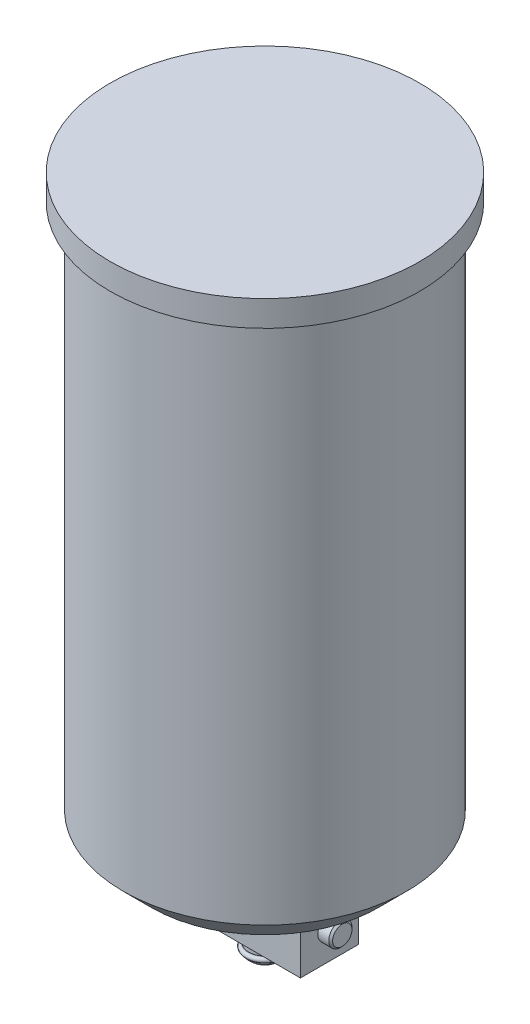
ISO-10303-21;
HEADER;
FILE_DESCRIPTION(('STEP AP214'),'2;1');
FILE_NAME('part.step','',(''),(''),'','','');
FILE_SCHEMA(('AUTOMOTIVE_DESIGN { 1 0 10303 214 1 1 1 1 }'));
ENDSEC;
DATA;
#1=APPLICATION_CONTEXT('core data for automotive mechanical design processes');
#2=APPLICATION_PROTOCOL_DEFINITION('international standard','automotive_design',2000,#1);
#3=PRODUCT_CONTEXT('',#1,'mechanical');
#4=PRODUCT('Part','Part','',(#3));
#5=PRODUCT_RELATED_PRODUCT_CATEGORY('part','',(#4));
#6=PRODUCT_DEFINITION_FORMATION('','',#4);
#7=PRODUCT_DEFINITION_CONTEXT('part definition',#1,'design');
#8=PRODUCT_DEFINITION('design','',#6,#7);
#9=PRODUCT_DEFINITION_SHAPE('','',#8);
#10=(LENGTH_UNIT() NAMED_UNIT(*) SI_UNIT(.MILLI.,.METRE.));
#11=(NAMED_UNIT(*) PLANE_ANGLE_UNIT() SI_UNIT($,.RADIAN.));
#12=(NAMED_UNIT(*) SI_UNIT($,.STERADIAN.) SOLID_ANGLE_UNIT());
#13=UNCERTAINTY_MEASURE_WITH_UNIT(LENGTH_MEASURE(1.E-05),#10,'distance_accuracy_value','');
#14=(GEOMETRIC_REPRESENTATION_CONTEXT(3) GLOBAL_UNCERTAINTY_ASSIGNED_CONTEXT((#13)) GLOBAL_UNIT_ASSIGNED_CONTEXT((#10,
#11,#12)) REPRESENTATION_CONTEXT('',''));
#15=CARTESIAN_POINT('',(0.,0.,0.));
#16=DIRECTION('',(0.,0.,1.));
#17=DIRECTION('',(1.,0.,0.));
#18=AXIS2_PLACEMENT_3D('',#15,#16,#17);
#19=CARTESIAN_POINT('',(-10.,-11.,-4.5));
#20=DIRECTION('',(-1.,0.,0.));
#21=DIRECTION('',(0.,0.,1.));
#22=AXIS2_PLACEMENT_3D('',#19,#20,#21);
#23=PLANE('',#22);
#24=DIRECTION('',(0.,0.,1.));
#25=VECTOR('',#24,1.);
#26=CARTESIAN_POINT('',(-10.,-2.,-5.5));
#27=LINE('',#26,#25);
#28=CARTESIAN_POINT('',(-10.,-2.,-5.5));
#29=VERTEX_POINT('',#28);
#30=CARTESIAN_POINT('',(-10.,-2.,-4.5));
#31=VERTEX_POINT('',#30);
#32=EDGE_CURVE('E108',#29,#31,#27,.T.);
#33=ORIENTED_EDGE('',*,*,#32,.T.);
#34=DIRECTION('',(0.,1.,0.));
#35=VECTOR('',#34,1.);
#36=CARTESIAN_POINT('',(-10.,-11.,-4.5));
#37=LINE('',#36,#35);
#38=CARTESIAN_POINT('',(-10.,-11.,-4.5));
#39=VERTEX_POINT('',#38);
#40=EDGE_CURVE('E159',#39,#31,#37,.T.);
#41=ORIENTED_EDGE('',*,*,#40,.F.);
#42=DIRECTION('',(0.,0.,1.));
#43=VECTOR('',#42,1.);
#44=CARTESIAN_POINT('',(-10.,-11.,-4.5));
#45=LINE('',#44,#43);
#46=CARTESIAN_POINT('',(-10.,-11.,4.5));
#47=VERTEX_POINT('',#46);
#48=EDGE_CURVE('E145',#39,#47,#45,.T.);
#49=ORIENTED_EDGE('',*,*,#48,.T.);
#50=DIRECTION('',(0.,1.,0.));
#51=VECTOR('',#50,1.);
#52=CARTESIAN_POINT('',(-10.,-11.,4.5));
#53=LINE('',#52,#51);
#54=CARTESIAN_POINT('',(-10.,-2.,4.5));
#55=VERTEX_POINT('',#54);
#56=EDGE_CURVE('E107',#47,#55,#53,.T.);
#57=ORIENTED_EDGE('',*,*,#56,.T.);
#58=CARTESIAN_POINT('',(-10.,-2.,5.5));
#59=VERTEX_POINT('',#58);
#60=EDGE_CURVE('E59',#55,#59,#27,.T.);
#61=ORIENTED_EDGE('',*,*,#60,.T.);
#62=DIRECTION('',(0.,1.,0.));
#63=VECTOR('',#62,1.);
#64=CARTESIAN_POINT('',(-10.,-2.,5.5));
#65=LINE('',#64,#63);
#66=CARTESIAN_POINT('',(-10.,0.,5.5));
#67=VERTEX_POINT('',#66);
#68=EDGE_CURVE('E104',#59,#67,#65,.T.);
#69=ORIENTED_EDGE('',*,*,#68,.T.);
#70=DIRECTION('',(0.,0.,1.));
#71=VECTOR('',#70,1.);
#72=CARTESIAN_POINT('',(-10.,0.,-4.5));
#73=LINE('',#72,#71);
#74=CARTESIAN_POINT('',(-10.,0.,-5.5));
#75=VERTEX_POINT('',#74);
#76=EDGE_CURVE('E144',#75,#67,#73,.T.);
#77=ORIENTED_EDGE('',*,*,#76,.F.);
#78=DIRECTION('',(0.,1.,0.));
#79=VECTOR('',#78,1.);
#80=CARTESIAN_POINT('',(-10.,-2.,-5.5));
#81=LINE('',#80,#79);
#82=EDGE_CURVE('E135',#29,#75,#81,.T.);
#83=ORIENTED_EDGE('',*,*,#82,.F.);
#84=EDGE_LOOP('',(#33,#41,#49,#57,#61,#69,#77,#83));
#85=FACE_BOUND('',#84,.T.);
#86=CARTESIAN_POINT('',(-10.,-6.5,0.));
#87=DIRECTION('',(-1.,0.,0.));
#88=DIRECTION('',(0.,0.,1.));
#89=AXIS2_PLACEMENT_3D('',#86,#87,#88);
#90=CIRCLE('',#89,0.900000000000001);
#91=CARTESIAN_POINT('',(-10.,-6.5,0.900000000000001));
#92=VERTEX_POINT('',#91);
#93=EDGE_CURVE('E38',#92,#92,#90,.F.);
#94=ORIENTED_EDGE('',*,*,#93,.T.);
#95=EDGE_LOOP('',(#94));
#96=FACE_BOUND('',#95,.T.);
#97=ADVANCED_FACE('F34',(#85,#96),#23,.T.);
#98=CARTESIAN_POINT('',(10.,-11.,4.5));
#99=DIRECTION('',(1.,0.,0.));
#100=DIRECTION('',(0.,0.,-1.));
#101=AXIS2_PLACEMENT_3D('',#98,#99,#100);
#102=PLANE('',#101);
#103=DIRECTION('',(0.,0.,-1.));
#104=VECTOR('',#103,1.);
#105=CARTESIAN_POINT('',(10.,-2.,5.5));
#106=LINE('',#105,#104);
#107=CARTESIAN_POINT('',(10.,-2.,5.5));
#108=VERTEX_POINT('',#107);
#109=CARTESIAN_POINT('',(10.,-2.,4.5));
#110=VERTEX_POINT('',#109);
#111=EDGE_CURVE('E124',#108,#110,#106,.T.);
#112=ORIENTED_EDGE('',*,*,#111,.T.);
#113=DIRECTION('',(0.,1.,0.));
#114=VECTOR('',#113,1.);
#115=CARTESIAN_POINT('',(10.,-11.,4.5));
#116=LINE('',#115,#114);
#117=CARTESIAN_POINT('',(10.,-11.,4.5));
#118=VERTEX_POINT('',#117);
#119=EDGE_CURVE('E166',#118,#110,#116,.T.);
#120=ORIENTED_EDGE('',*,*,#119,.F.);
#121=DIRECTION('',(0.,0.,-1.));
#122=VECTOR('',#121,1.);
#123=CARTESIAN_POINT('',(10.,-11.,4.5));
#124=LINE('',#123,#122);
#125=CARTESIAN_POINT('',(10.,-11.,-4.5));
#126=VERTEX_POINT('',#125);
#127=EDGE_CURVE('E151',#118,#126,#124,.T.);
#128=ORIENTED_EDGE('',*,*,#127,.T.);
#129=DIRECTION('',(0.,1.,0.));
#130=VECTOR('',#129,1.);
#131=CARTESIAN_POINT('',(10.,-11.,-4.5));
#132=LINE('',#131,#130);
#133=CARTESIAN_POINT('',(10.,-2.,-4.5));
#134=VERTEX_POINT('',#133);
#135=EDGE_CURVE('E163',#126,#134,#132,.T.);
#136=ORIENTED_EDGE('',*,*,#135,.T.);
#137=CARTESIAN_POINT('',(10.,-2.,-5.5));
#138=VERTEX_POINT('',#137);
#139=EDGE_CURVE('E51',#134,#138,#106,.T.);
#140=ORIENTED_EDGE('',*,*,#139,.T.);
#141=DIRECTION('',(0.,1.,0.));
#142=VECTOR('',#141,1.);
#143=CARTESIAN_POINT('',(10.,-2.,-5.5));
#144=LINE('',#143,#142);
#145=CARTESIAN_POINT('',(10.,0.,-5.5));
#146=VERTEX_POINT('',#145);
#147=EDGE_CURVE('E139',#138,#146,#144,.T.);
#148=ORIENTED_EDGE('',*,*,#147,.T.);
#149=DIRECTION('',(0.,0.,-1.));
#150=VECTOR('',#149,1.);
#151=CARTESIAN_POINT('',(10.,0.,4.5));
#152=LINE('',#151,#150);
#153=CARTESIAN_POINT('',(10.,0.,5.5));
#154=VERTEX_POINT('',#153);
#155=EDGE_CURVE('E148',#154,#146,#152,.T.);
#156=ORIENTED_EDGE('',*,*,#155,.F.);
#157=DIRECTION('',(0.,1.,0.));
#158=VECTOR('',#157,1.);
#159=CARTESIAN_POINT('',(10.,-2.,5.5));
#160=LINE('',#159,#158);
#161=EDGE_CURVE('E118',#108,#154,#160,.T.);
#162=ORIENTED_EDGE('',*,*,#161,.F.);
#163=EDGE_LOOP('',(#112,#120,#128,#136,#140,#148,#156,#162));
#164=FACE_BOUND('',#163,.T.);
#165=CARTESIAN_POINT('',(10.,-6.5,0.));
#166=DIRECTION('',(1.,0.,0.));
#167=DIRECTION('',(0.,0.,-1.));
#168=AXIS2_PLACEMENT_3D('',#165,#166,#167);
#169=CIRCLE('',#168,1.8);
#170=CARTESIAN_POINT('',(10.,-6.5,-1.8));
#171=VERTEX_POINT('',#170);
#172=EDGE_CURVE('E184',#171,#171,#169,.F.);
#173=ORIENTED_EDGE('',*,*,#172,.T.);
#174=EDGE_LOOP('',(#173));
#175=FACE_BOUND('',#174,.T.);
#176=ADVANCED_FACE('F270',(#164,#175),#102,.T.);
#177=CARTESIAN_POINT('',(0.,-11.,0.));
#178=DIRECTION('',(0.,1.,0.));
#179=DIRECTION('',(0.,0.,1.));
#180=AXIS2_PLACEMENT_3D('',#177,#178,#179);
#181=PLANE('',#180);
#182=ORIENTED_EDGE('',*,*,#48,.F.);
#183=DIRECTION('',(-1.,0.,0.));
#184=VECTOR('',#183,1.);
#185=CARTESIAN_POINT('',(10.,-11.,-4.5));
#186=LINE('',#185,#184);
#187=EDGE_CURVE('E154',#126,#39,#186,.T.);
#188=ORIENTED_EDGE('',*,*,#187,.F.);
#189=ORIENTED_EDGE('',*,*,#127,.F.);
#190=DIRECTION('',(1.,0.,0.));
#191=VECTOR('',#190,1.);
#192=CARTESIAN_POINT('',(-10.,-11.,4.5));
#193=LINE('',#192,#191);
#194=EDGE_CURVE('E147',#47,#118,#193,.T.);
#195=ORIENTED_EDGE('',*,*,#194,.F.);
#196=EDGE_LOOP('',(#182,#188,#189,#195));
#197=FACE_BOUND('',#196,.T.);
#198=CARTESIAN_POINT('',(0.,-11.,0.));
#199=DIRECTION('',(0.,1.,0.));
#200=DIRECTION('',(0.,0.,1.));
#201=AXIS2_PLACEMENT_3D('',#198,#199,#200);
#202=CIRCLE('',#201,2.5);
#203=CARTESIAN_POINT('',(0.,-11.,2.5));
#204=VERTEX_POINT('',#203);
#205=EDGE_CURVE('E11',#204,#204,#202,.F.);
#206=ORIENTED_EDGE('',*,*,#205,.F.);
#207=EDGE_LOOP('',(#206));
#208=FACE_BOUND('',#207,.T.);
#209=ADVANCED_FACE('F275',(#197,#208),#181,.F.);
#210=CARTESIAN_POINT('',(10.,-11.,-4.5));
#211=DIRECTION('',(0.,0.,-1.));
#212=DIRECTION('',(-1.,0.,0.));
#213=AXIS2_PLACEMENT_3D('',#210,#211,#212);
#214=PLANE('',#213);
#215=ORIENTED_EDGE('',*,*,#40,.T.);
#216=DIRECTION('',(1.,0.,0.));
#217=VECTOR('',#216,1.);
#218=CARTESIAN_POINT('',(10.,-2.,-4.5));
#219=LINE('',#218,#217);
#220=EDGE_CURVE('E138',#31,#134,#219,.T.);
#221=ORIENTED_EDGE('',*,*,#220,.T.);
#222=ORIENTED_EDGE('',*,*,#135,.F.);
#223=ORIENTED_EDGE('',*,*,#187,.T.);
#224=EDGE_LOOP('',(#215,#221,#222,#223));
#225=FACE_BOUND('',#224,.T.);
#226=ADVANCED_FACE('F316',(#225),#214,.T.);
#227=CARTESIAN_POINT('',(-10.,-11.,4.5));
#228=DIRECTION('',(0.,0.,1.));
#229=DIRECTION('',(1.,0.,0.));
#230=AXIS2_PLACEMENT_3D('',#227,#228,#229);
#231=PLANE('',#230);
#232=ORIENTED_EDGE('',*,*,#119,.T.);
#233=DIRECTION('',(-1.,0.,0.));
#234=VECTOR('',#233,1.);
#235=CARTESIAN_POINT('',(-10.,-2.,4.5));
#236=LINE('',#235,#234);
#237=EDGE_CURVE('E43',#110,#55,#236,.T.);
#238=ORIENTED_EDGE('',*,*,#237,.T.);
#239=ORIENTED_EDGE('',*,*,#56,.F.);
#240=ORIENTED_EDGE('',*,*,#194,.T.);
#241=EDGE_LOOP('',(#232,#238,#239,#240));
#242=FACE_BOUND('',#241,.T.);
#243=ADVANCED_FACE('F280',(#242),#231,.T.);
#244=CARTESIAN_POINT('',(0.,90.,0.));
#245=DIRECTION('',(0.,-1.,0.));
#246=DIRECTION('',(0.,0.,-1.));
#247=AXIS2_PLACEMENT_3D('',#244,#245,#246);
#248=PLANE('',#247);
#249=CARTESIAN_POINT('',(0.,90.,0.));
#250=DIRECTION('',(0.,1.,0.));
#251=DIRECTION('',(0.,0.,1.));
#252=AXIS2_PLACEMENT_3D('',#249,#250,#251);
#253=CIRCLE('',#252,24.);
#254=CARTESIAN_POINT('',(0.,90.,24.));
#255=VERTEX_POINT('',#254);
#256=EDGE_CURVE('E181',#255,#255,#253,.T.);
#257=ORIENTED_EDGE('',*,*,#256,.T.);
#258=EDGE_LOOP('',(#257));
#259=FACE_BOUND('',#258,.T.);
#260=ADVANCED_FACE('F36',(#259),#248,.F.);
#261=CARTESIAN_POINT('',(0.,0.,0.));
#262=DIRECTION('',(0.,1.,0.));
#263=DIRECTION('',(0.,0.,1.));
#264=AXIS2_PLACEMENT_3D('',#261,#262,#263);
#265=CYLINDRICAL_SURFACE('',#264,24.);
#266=ORIENTED_EDGE('',*,*,#256,.F.);
#267=EDGE_LOOP('',(#266));
#268=FACE_BOUND('',#267,.T.);
#269=CARTESIAN_POINT('',(0.,86.,0.));
#270=DIRECTION('',(0.,1.,0.));
#271=DIRECTION('',(0.,0.,1.));
#272=AXIS2_PLACEMENT_3D('',#269,#270,#271);
#273=CIRCLE('',#272,24.);
#274=CARTESIAN_POINT('',(0.,86.,24.));
#275=VERTEX_POINT('',#274);
#276=EDGE_CURVE('E178',#275,#275,#273,.T.);
#277=ORIENTED_EDGE('',*,*,#276,.T.);
#278=EDGE_LOOP('',(#277));
#279=FACE_BOUND('',#278,.T.);
#280=ADVANCED_FACE('F295',(#268,#279),#265,.T.);
#281=CARTESIAN_POINT('',(24.,86.,0.));
#282=DIRECTION('',(0.,1.,0.));
#283=DIRECTION('',(0.,0.,1.));
#284=AXIS2_PLACEMENT_3D('',#281,#282,#283);
#285=PLANE('',#284);
#286=ORIENTED_EDGE('',*,*,#276,.F.);
#287=EDGE_LOOP('',(#286));
#288=FACE_BOUND('',#287,.T.);
#289=CARTESIAN_POINT('',(0.,86.,0.));
#290=DIRECTION('',(0.,1.,0.));
#291=DIRECTION('',(0.,0.,1.));
#292=AXIS2_PLACEMENT_3D('',#289,#290,#291);
#293=CIRCLE('',#292,22.);
#294=CARTESIAN_POINT('',(0.,86.,22.));
#295=VERTEX_POINT('',#294);
#296=EDGE_CURVE('E175',#295,#295,#293,.T.);
#297=ORIENTED_EDGE('',*,*,#296,.T.);
#298=EDGE_LOOP('',(#297));
#299=FACE_BOUND('',#298,.T.);
#300=ADVANCED_FACE('F292',(#288,#299),#285,.F.);
#301=CARTESIAN_POINT('',(0.,0.,0.));
#302=DIRECTION('',(0.,1.,0.));
#303=DIRECTION('',(0.,0.,1.));
#304=AXIS2_PLACEMENT_3D('',#301,#302,#303);
#305=CYLINDRICAL_SURFACE('',#304,22.);
#306=ORIENTED_EDGE('',*,*,#296,.F.);
#307=EDGE_LOOP('',(#306));
#308=FACE_BOUND('',#307,.T.);
#309=CARTESIAN_POINT('',(0.,4.40000000000001,0.));
#310=DIRECTION('',(0.,1.,0.));
#311=DIRECTION('',(0.,0.,1.));
#312=AXIS2_PLACEMENT_3D('',#309,#310,#311);
#313=CIRCLE('',#312,22.);
#314=CARTESIAN_POINT('',(0.,4.40000000000001,22.));
#315=VERTEX_POINT('',#314);
#316=EDGE_CURVE('E172',#315,#315,#313,.T.);
#317=ORIENTED_EDGE('',*,*,#316,.T.);
#318=EDGE_LOOP('',(#317));
#319=FACE_BOUND('',#318,.T.);
#320=ADVANCED_FACE('F288',(#308,#319),#305,.T.);
#321=CARTESIAN_POINT('',(0.,0.,0.));
#322=DIRECTION('',(0.,1.,0.));
#323=DIRECTION('',(0.,0.,1.));
#324=AXIS2_PLACEMENT_3D('',#321,#322,#323);
#325=CONICAL_SURFACE('',#324,17.6,0.785398163397447);
#326=ORIENTED_EDGE('',*,*,#316,.F.);
#327=EDGE_LOOP('',(#326));
#328=FACE_BOUND('',#327,.T.);
#329=CARTESIAN_POINT('',(0.,0.,0.));
#330=DIRECTION('',(0.,1.,0.));
#331=DIRECTION('',(0.,0.,1.));
#332=AXIS2_PLACEMENT_3D('',#329,#330,#331);
#333=CIRCLE('',#332,17.6);
#334=CARTESIAN_POINT('',(0.,0.,17.6));
#335=VERTEX_POINT('',#334);
#336=EDGE_CURVE('E162',#335,#335,#333,.T.);
#337=ORIENTED_EDGE('',*,*,#336,.T.);
#338=EDGE_LOOP('',(#337));
#339=FACE_BOUND('',#338,.T.);
#340=ADVANCED_FACE('F284',(#328,#339),#325,.T.);
#341=CARTESIAN_POINT('',(17.6,0.,0.));
#342=DIRECTION('',(0.,1.,0.));
#343=DIRECTION('',(0.,0.,1.));
#344=AXIS2_PLACEMENT_3D('',#341,#342,#343);
#345=PLANE('',#344);
#346=DIRECTION('',(-1.,0.,0.));
#347=VECTOR('',#346,1.);
#348=CARTESIAN_POINT('',(10.,0.,-5.5));
#349=LINE('',#348,#347);
#350=EDGE_CURVE('E109',#146,#75,#349,.T.);
#351=ORIENTED_EDGE('',*,*,#350,.T.);
#352=ORIENTED_EDGE('',*,*,#76,.T.);
#353=DIRECTION('',(1.,0.,0.));
#354=VECTOR('',#353,1.);
#355=CARTESIAN_POINT('',(-10.,0.,5.5));
#356=LINE('',#355,#354);
#357=EDGE_CURVE('E117',#67,#154,#356,.T.);
#358=ORIENTED_EDGE('',*,*,#357,.T.);
#359=ORIENTED_EDGE('',*,*,#155,.T.);
#360=EDGE_LOOP('',(#351,#352,#358,#359));
#361=FACE_BOUND('',#360,.T.);
#362=ORIENTED_EDGE('',*,*,#336,.F.);
#363=EDGE_LOOP('',(#362));
#364=FACE_BOUND('',#363,.T.);
#365=ADVANCED_FACE('F281',(#361,#364),#345,.F.);
#366=CARTESIAN_POINT('',(0.,-2.,0.));
#367=DIRECTION('',(0.,1.,0.));
#368=DIRECTION('',(0.,0.,1.));
#369=AXIS2_PLACEMENT_3D('',#366,#367,#368);
#370=PLANE('',#369);
#371=ORIENTED_EDGE('',*,*,#237,.F.);
#372=ORIENTED_EDGE('',*,*,#111,.F.);
#373=DIRECTION('',(1.,0.,0.));
#374=VECTOR('',#373,1.);
#375=CARTESIAN_POINT('',(-10.,-2.,5.5));
#376=LINE('',#375,#374);
#377=EDGE_CURVE('E115',#59,#108,#376,.T.);
#378=ORIENTED_EDGE('',*,*,#377,.F.);
#379=ORIENTED_EDGE('',*,*,#60,.F.);
#380=EDGE_LOOP('',(#371,#372,#378,#379));
#381=FACE_BOUND('',#380,.T.);
#382=ADVANCED_FACE('F122',(#381),#370,.F.);
#383=CARTESIAN_POINT('',(-10.,-2.,5.5));
#384=DIRECTION('',(0.,0.,1.));
#385=DIRECTION('',(1.,0.,0.));
#386=AXIS2_PLACEMENT_3D('',#383,#384,#385);
#387=PLANE('',#386);
#388=ORIENTED_EDGE('',*,*,#357,.F.);
#389=ORIENTED_EDGE('',*,*,#68,.F.);
#390=ORIENTED_EDGE('',*,*,#377,.T.);
#391=ORIENTED_EDGE('',*,*,#161,.T.);
#392=EDGE_LOOP('',(#388,#389,#390,#391));
#393=FACE_BOUND('',#392,.T.);
#394=ADVANCED_FACE('F113',(#393),#387,.T.);
#395=ORIENTED_EDGE('',*,*,#220,.F.);
#396=ORIENTED_EDGE('',*,*,#32,.F.);
#397=DIRECTION('',(-1.,0.,0.));
#398=VECTOR('',#397,1.);
#399=CARTESIAN_POINT('',(10.,-2.,-5.5));
#400=LINE('',#399,#398);
#401=EDGE_CURVE('E119',#138,#29,#400,.T.);
#402=ORIENTED_EDGE('',*,*,#401,.F.);
#403=ORIENTED_EDGE('',*,*,#139,.F.);
#404=EDGE_LOOP('',(#395,#396,#402,#403));
#405=FACE_BOUND('',#404,.T.);
#406=ADVANCED_FACE('F334',(#405),#370,.F.);
#407=CARTESIAN_POINT('',(10.,-2.,-5.5));
#408=DIRECTION('',(0.,0.,-1.));
#409=DIRECTION('',(-1.,0.,0.));
#410=AXIS2_PLACEMENT_3D('',#407,#408,#409);
#411=PLANE('',#410);
#412=ORIENTED_EDGE('',*,*,#350,.F.);
#413=ORIENTED_EDGE('',*,*,#147,.F.);
#414=ORIENTED_EDGE('',*,*,#401,.T.);
#415=ORIENTED_EDGE('',*,*,#82,.T.);
#416=EDGE_LOOP('',(#412,#413,#414,#415));
#417=FACE_BOUND('',#416,.T.);
#418=ADVANCED_FACE('F332',(#417),#411,.T.);
#419=CARTESIAN_POINT('',(0.,-15.,0.));
#420=DIRECTION('',(0.,1.,0.));
#421=DIRECTION('',(0.,0.,1.));
#422=AXIS2_PLACEMENT_3D('',#419,#420,#421);
#423=CYLINDRICAL_SURFACE('',#422,2.5);
#424=ORIENTED_EDGE('',*,*,#205,.T.);
#425=EDGE_LOOP('',(#424));
#426=FACE_BOUND('',#425,.T.);
#427=CARTESIAN_POINT('',(0.,-13.5333333333333,0.));
#428=DIRECTION('',(0.,1.,0.));
#429=DIRECTION('',(0.,0.,1.));
#430=AXIS2_PLACEMENT_3D('',#427,#428,#429);
#431=CIRCLE('',#430,2.5);
#432=CARTESIAN_POINT('',(0.,-13.5333333333333,2.5));
#433=VERTEX_POINT('',#432);
#434=EDGE_CURVE('E132',#433,#433,#431,.T.);
#435=ORIENTED_EDGE('',*,*,#434,.T.);
#436=EDGE_LOOP('',(#435));
#437=FACE_BOUND('',#436,.T.);
#438=ADVANCED_FACE('F220',(#426,#437),#423,.T.);
#439=CARTESIAN_POINT('',(2.5,-13.5333333333333,0.));
#440=DIRECTION('',(0.,-1.,0.));
#441=DIRECTION('',(0.,0.,-1.));
#442=AXIS2_PLACEMENT_3D('',#439,#440,#441);
#443=PLANE('',#442);
#444=ORIENTED_EDGE('',*,*,#434,.F.);
#445=EDGE_LOOP('',(#444));
#446=FACE_BOUND('',#445,.T.);
#447=CARTESIAN_POINT('',(0.,-13.5333333333333,0.));
#448=DIRECTION('',(0.,1.,0.));
#449=DIRECTION('',(0.,0.,1.));
#450=AXIS2_PLACEMENT_3D('',#447,#448,#449);
#451=CIRCLE('',#450,2.6);
#452=CARTESIAN_POINT('',(0.,-13.5333333333333,2.6));
#453=VERTEX_POINT('',#452);
#454=EDGE_CURVE('E215',#453,#453,#451,.T.);
#455=ORIENTED_EDGE('',*,*,#454,.T.);
#456=EDGE_LOOP('',(#455));
#457=FACE_BOUND('',#456,.T.);
#458=ADVANCED_FACE('F222',(#446,#457),#443,.F.);
#459=CARTESIAN_POINT('',(0.,-13.9333333333333,0.));
#460=DIRECTION('',(0.,1.,0.));
#461=DIRECTION('',(0.,0.,1.));
#462=AXIS2_PLACEMENT_3D('',#459,#460,#461);
#463=TOROIDAL_SURFACE('',#462,2.6,0.4);
#464=ORIENTED_EDGE('',*,*,#454,.F.);
#465=EDGE_LOOP('',(#464));
#466=FACE_BOUND('',#465,.T.);
#467=CARTESIAN_POINT('',(0.,-14.3333333333333,0.));
#468=DIRECTION('',(0.,1.,0.));
#469=DIRECTION('',(0.,0.,1.));
#470=AXIS2_PLACEMENT_3D('',#467,#468,#469);
#471=CIRCLE('',#470,2.6);
#472=CARTESIAN_POINT('',(0.,-14.3333333333333,2.6));
#473=VERTEX_POINT('',#472);
#474=EDGE_CURVE('E212',#473,#473,#471,.T.);
#475=ORIENTED_EDGE('',*,*,#474,.T.);
#476=EDGE_LOOP('',(#475));
#477=FACE_BOUND('',#476,.T.);
#478=ADVANCED_FACE('F225',(#466,#477),#463,.T.);
#479=CARTESIAN_POINT('',(2.6,-14.3333333333333,0.));
#480=DIRECTION('',(0.,1.,0.));
#481=DIRECTION('',(0.,0.,1.));
#482=AXIS2_PLACEMENT_3D('',#479,#480,#481);
#483=PLANE('',#482);
#484=ORIENTED_EDGE('',*,*,#474,.F.);
#485=EDGE_LOOP('',(#484));
#486=FACE_BOUND('',#485,.T.);
#487=CARTESIAN_POINT('',(0.,-14.3333333333333,0.));
#488=DIRECTION('',(0.,1.,0.));
#489=DIRECTION('',(0.,0.,1.));
#490=AXIS2_PLACEMENT_3D('',#487,#488,#489);
#491=CIRCLE('',#490,2.5);
#492=CARTESIAN_POINT('',(0.,-14.3333333333333,2.5));
#493=VERTEX_POINT('',#492);
#494=EDGE_CURVE('E209',#493,#493,#491,.T.);
#495=ORIENTED_EDGE('',*,*,#494,.T.);
#496=EDGE_LOOP('',(#495));
#497=FACE_BOUND('',#496,.T.);
#498=ADVANCED_FACE('F231',(#486,#497),#483,.F.);
#499=CARTESIAN_POINT('',(0.,-15.,0.));
#500=DIRECTION('',(0.,1.,0.));
#501=DIRECTION('',(0.,0.,1.));
#502=AXIS2_PLACEMENT_3D('',#499,#500,#501);
#503=CYLINDRICAL_SURFACE('',#502,2.5);
#504=ORIENTED_EDGE('',*,*,#494,.F.);
#505=EDGE_LOOP('',(#504));
#506=FACE_BOUND('',#505,.T.);
#507=CARTESIAN_POINT('',(0.,-14.6666666666667,0.));
#508=DIRECTION('',(0.,1.,0.));
#509=DIRECTION('',(0.,0.,1.));
#510=AXIS2_PLACEMENT_3D('',#507,#508,#509);
#511=CIRCLE('',#510,2.5);
#512=CARTESIAN_POINT('',(0.,-14.6666666666667,2.5));
#513=VERTEX_POINT('',#512);
#514=EDGE_CURVE('E206',#513,#513,#511,.T.);
#515=ORIENTED_EDGE('',*,*,#514,.T.);
#516=EDGE_LOOP('',(#515));
#517=FACE_BOUND('',#516,.T.);
#518=ADVANCED_FACE('F237',(#506,#517),#503,.T.);
#519=CARTESIAN_POINT('',(2.5,-14.6666666666667,0.));
#520=DIRECTION('',(0.,1.,0.));
#521=DIRECTION('',(0.,0.,1.));
#522=AXIS2_PLACEMENT_3D('',#519,#520,#521);
#523=PLANE('',#522);
#524=ORIENTED_EDGE('',*,*,#514,.F.);
#525=EDGE_LOOP('',(#524));
#526=FACE_BOUND('',#525,.T.);
#527=CARTESIAN_POINT('',(0.,-14.6666666666667,0.));
#528=DIRECTION('',(0.,1.,0.));
#529=DIRECTION('',(0.,0.,1.));
#530=AXIS2_PLACEMENT_3D('',#527,#528,#529);
#531=CIRCLE('',#530,2.14285714285714);
#532=CARTESIAN_POINT('',(0.,-14.6666666666667,2.14285714285714));
#533=VERTEX_POINT('',#532);
#534=EDGE_CURVE('E203',#533,#533,#531,.T.);
#535=ORIENTED_EDGE('',*,*,#534,.T.);
#536=EDGE_LOOP('',(#535));
#537=FACE_BOUND('',#536,.T.);
#538=ADVANCED_FACE('F243',(#526,#537),#523,.F.);
#539=CARTESIAN_POINT('',(0.,-15.,0.));
#540=DIRECTION('',(0.,1.,0.));
#541=DIRECTION('',(0.,0.,1.));
#542=AXIS2_PLACEMENT_3D('',#539,#540,#541);
#543=CYLINDRICAL_SURFACE('',#542,2.14285714285714);
#544=ORIENTED_EDGE('',*,*,#534,.F.);
#545=EDGE_LOOP('',(#544));
#546=FACE_BOUND('',#545,.T.);
#547=CARTESIAN_POINT('',(0.,-15.,0.));
#548=DIRECTION('',(0.,1.,0.));
#549=DIRECTION('',(0.,0.,1.));
#550=AXIS2_PLACEMENT_3D('',#547,#548,#549);
#551=CIRCLE('',#550,2.14285714285714);
#552=CARTESIAN_POINT('',(0.,-15.,2.14285714285714));
#553=VERTEX_POINT('',#552);
#554=EDGE_CURVE('E190',#553,#553,#551,.T.);
#555=ORIENTED_EDGE('',*,*,#554,.T.);
#556=EDGE_LOOP('',(#555));
#557=FACE_BOUND('',#556,.T.);
#558=ADVANCED_FACE('F249',(#546,#557),#543,.T.);
#559=CARTESIAN_POINT('',(2.14285714285714,-15.,0.));
#560=DIRECTION('',(0.,1.,0.));
#561=DIRECTION('',(0.,0.,1.));
#562=AXIS2_PLACEMENT_3D('',#559,#560,#561);
#563=PLANE('',#562);
#564=ORIENTED_EDGE('',*,*,#554,.F.);
#565=EDGE_LOOP('',(#564));
#566=FACE_BOUND('',#565,.T.);
#567=ADVANCED_FACE('F255',(#566),#563,.F.);
#568=CARTESIAN_POINT('',(12.,-5.,0.));
#569=DIRECTION('',(-1.,0.,0.));
#570=DIRECTION('',(0.,0.,1.));
#571=AXIS2_PLACEMENT_3D('',#568,#569,#570);
#572=PLANE('',#571);
#573=CARTESIAN_POINT('',(12.,-6.5,0.));
#574=DIRECTION('',(-1.,0.,0.));
#575=DIRECTION('',(0.,0.,1.));
#576=AXIS2_PLACEMENT_3D('',#573,#574,#575);
#577=CIRCLE('',#576,1.5);
#578=CARTESIAN_POINT('',(12.,-6.5,1.5));
#579=VERTEX_POINT('',#578);
#580=EDGE_CURVE('E508',#579,#579,#577,.T.);
#581=ORIENTED_EDGE('',*,*,#580,.F.);
#582=EDGE_LOOP('',(#581));
#583=FACE_BOUND('',#582,.T.);
#584=ADVANCED_FACE('F260',(#583),#572,.F.);
#585=CARTESIAN_POINT('',(12.,-6.5,0.));
#586=DIRECTION('',(-1.,0.,0.));
#587=DIRECTION('',(0.,0.,1.));
#588=AXIS2_PLACEMENT_3D('',#585,#586,#587);
#589=CONICAL_SURFACE('',#588,1.5,0.785398163397448);
#590=CARTESIAN_POINT('',(11.7,-6.5,0.));
#591=DIRECTION('',(-1.,0.,0.));
#592=DIRECTION('',(0.,0.,1.));
#593=AXIS2_PLACEMENT_3D('',#590,#591,#592);
#594=CIRCLE('',#593,1.8);
#595=CARTESIAN_POINT('',(11.7,-6.5,1.8));
#596=VERTEX_POINT('',#595);
#597=EDGE_CURVE('E197',#596,#596,#594,.T.);
#598=ORIENTED_EDGE('',*,*,#597,.F.);
#599=EDGE_LOOP('',(#598));
#600=FACE_BOUND('',#599,.T.);
#601=ORIENTED_EDGE('',*,*,#580,.T.);
#602=EDGE_LOOP('',(#601));
#603=FACE_BOUND('',#602,.T.);
#604=ADVANCED_FACE('F265',(#600,#603),#589,.T.);
#605=CARTESIAN_POINT('',(12.,-6.5,0.));
#606=DIRECTION('',(-1.,0.,0.));
#607=DIRECTION('',(0.,0.,1.));
#608=AXIS2_PLACEMENT_3D('',#605,#606,#607);
#609=CYLINDRICAL_SURFACE('',#608,1.8);
#610=ORIENTED_EDGE('',*,*,#172,.F.);
#611=EDGE_LOOP('',(#610));
#612=FACE_BOUND('',#611,.T.);
#613=ORIENTED_EDGE('',*,*,#597,.T.);
#614=EDGE_LOOP('',(#613));
#615=FACE_BOUND('',#614,.T.);
#616=ADVANCED_FACE('F449',(#612,#615),#609,.T.);
#617=CARTESIAN_POINT('',(-11.,-6.5,0.));
#618=DIRECTION('',(1.,0.,0.));
#619=DIRECTION('',(0.,0.,-1.));
#620=AXIS2_PLACEMENT_3D('',#617,#618,#619);
#621=PLANE('',#620);
#622=CARTESIAN_POINT('',(-11.,-6.5,0.));
#623=DIRECTION('',(-1.,0.,0.));
#624=DIRECTION('',(0.,0.,1.));
#625=AXIS2_PLACEMENT_3D('',#622,#623,#624);
#626=CIRCLE('',#625,0.675000000000001);
#627=CARTESIAN_POINT('',(-11.,-6.5,0.675000000000001));
#628=VERTEX_POINT('',#627);
#629=EDGE_CURVE('E186',#628,#628,#626,.T.);
#630=ORIENTED_EDGE('',*,*,#629,.T.);
#631=EDGE_LOOP('',(#630));
#632=FACE_BOUND('',#631,.T.);
#633=ADVANCED_FACE('F460',(#632),#621,.F.);
#634=CARTESIAN_POINT('',(-10.775,-6.5,0.));
#635=DIRECTION('',(1.,0.,0.));
#636=DIRECTION('',(0.,0.,-1.));
#637=AXIS2_PLACEMENT_3D('',#634,#635,#636);
#638=CONICAL_SURFACE('',#637,0.900000000000001,0.785398163397448);
#639=ORIENTED_EDGE('',*,*,#629,.F.);
#640=EDGE_LOOP('',(#639));
#641=FACE_BOUND('',#640,.T.);
#642=CARTESIAN_POINT('',(-10.775,-6.5,0.));
#643=DIRECTION('',(-1.,0.,0.));
#644=DIRECTION('',(0.,0.,1.));
#645=AXIS2_PLACEMENT_3D('',#642,#643,#644);
#646=CIRCLE('',#645,0.900000000000001);
#647=CARTESIAN_POINT('',(-10.775,-6.5,0.900000000000001));
#648=VERTEX_POINT('',#647);
#649=EDGE_CURVE('E192',#648,#648,#646,.T.);
#650=ORIENTED_EDGE('',*,*,#649,.T.);
#651=EDGE_LOOP('',(#650));
#652=FACE_BOUND('',#651,.T.);
#653=ADVANCED_FACE('F472',(#641,#652),#638,.T.);
#654=CARTESIAN_POINT('',(12.,-6.5,0.));
#655=DIRECTION('',(-1.,0.,0.));
#656=DIRECTION('',(0.,0.,1.));
#657=AXIS2_PLACEMENT_3D('',#654,#655,#656);
#658=CYLINDRICAL_SURFACE('',#657,0.900000000000001);
#659=ORIENTED_EDGE('',*,*,#93,.F.);
#660=EDGE_LOOP('',(#659));
#661=FACE_BOUND('',#660,.T.);
#662=ORIENTED_EDGE('',*,*,#649,.F.);
#663=EDGE_LOOP('',(#662));
#664=FACE_BOUND('',#663,.T.);
#665=ADVANCED_FACE('F481',(#661,#664),#658,.T.);
#666=CLOSED_SHELL('',(#97,#176,#209,#226,#243,#260,#280,#300,#320,#340,#365,#382,#394,#406,#418,
#438,#458,#478,#498,#518,#538,#558,#567,#584,#604,#616,#633,#653,#665));
#667=MANIFOLD_SOLID_BREP('B2',#666);
#668=ADVANCED_BREP_SHAPE_REPRESENTATION('',(#18,#667),#14);
#669=SHAPE_DEFINITION_REPRESENTATION(#9,#668);
ENDSEC;
END-ISO-10303-21;
